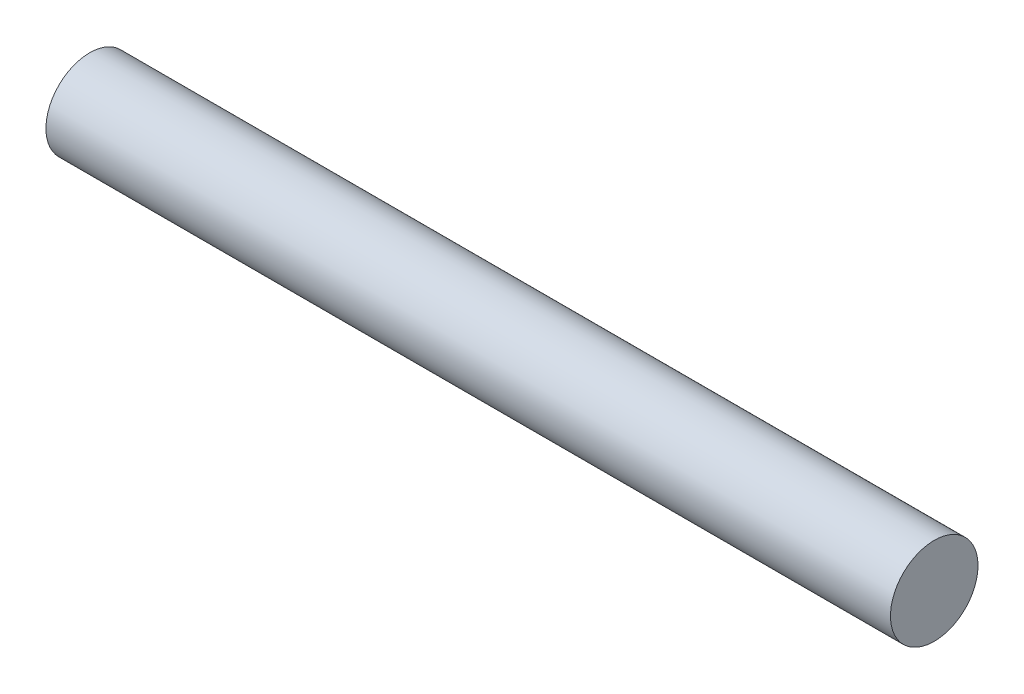
ISO-10303-21;
HEADER;
FILE_DESCRIPTION(('STEP AP214'),'2;1');
FILE_NAME('part.step','',(''),(''),'','','');
FILE_SCHEMA(('AUTOMOTIVE_DESIGN { 1 0 10303 214 1 1 1 1 }'));
ENDSEC;
DATA;
#1=APPLICATION_CONTEXT('core data for automotive mechanical design processes');
#2=APPLICATION_PROTOCOL_DEFINITION('international standard','automotive_design',2000,#1);
#3=PRODUCT_CONTEXT('',#1,'mechanical');
#4=PRODUCT('Part','Part','',(#3));
#5=PRODUCT_RELATED_PRODUCT_CATEGORY('part','',(#4));
#6=PRODUCT_DEFINITION_FORMATION('','',#4);
#7=PRODUCT_DEFINITION_CONTEXT('part definition',#1,'design');
#8=PRODUCT_DEFINITION('design','',#6,#7);
#9=PRODUCT_DEFINITION_SHAPE('','',#8);
#10=(LENGTH_UNIT() NAMED_UNIT(*) SI_UNIT(.MILLI.,.METRE.));
#11=(NAMED_UNIT(*) PLANE_ANGLE_UNIT() SI_UNIT($,.RADIAN.));
#12=(NAMED_UNIT(*) SI_UNIT($,.STERADIAN.) SOLID_ANGLE_UNIT());
#13=UNCERTAINTY_MEASURE_WITH_UNIT(LENGTH_MEASURE(1.E-05),#10,'distance_accuracy_value','');
#14=(GEOMETRIC_REPRESENTATION_CONTEXT(3) GLOBAL_UNCERTAINTY_ASSIGNED_CONTEXT((#13)) GLOBAL_UNIT_ASSIGNED_CONTEXT((#10,
#11,#12)) REPRESENTATION_CONTEXT('',''));
#15=CARTESIAN_POINT('',(0.,0.,0.));
#16=DIRECTION('',(0.,0.,1.));
#17=DIRECTION('',(1.,0.,0.));
#18=AXIS2_PLACEMENT_3D('',#15,#16,#17);
#19=CARTESIAN_POINT('',(110.,0.,0.));
#20=DIRECTION('',(-1.,0.,0.));
#21=DIRECTION('',(0.,0.,1.));
#22=AXIS2_PLACEMENT_3D('',#19,#20,#21);
#23=CYLINDRICAL_SURFACE('',#22,5.7);
#24=CARTESIAN_POINT('',(110.,0.,0.));
#25=DIRECTION('',(1.,0.,0.));
#26=DIRECTION('',(0.,0.,-1.));
#27=AXIS2_PLACEMENT_3D('',#24,#25,#26);
#28=CIRCLE('',#27,5.7);
#29=CARTESIAN_POINT('',(110.,0.,-5.7));
#30=VERTEX_POINT('',#29);
#31=EDGE_CURVE('E10',#30,#30,#28,.T.);
#32=ORIENTED_EDGE('',*,*,#31,.F.);
#33=EDGE_LOOP('',(#32));
#34=FACE_BOUND('',#33,.T.);
#35=CARTESIAN_POINT('',(0.,0.,0.));
#36=DIRECTION('',(1.,0.,0.));
#37=DIRECTION('',(0.,0.,-1.));
#38=AXIS2_PLACEMENT_3D('',#35,#36,#37);
#39=CIRCLE('',#38,5.7);
#40=CARTESIAN_POINT('',(0.,0.,-5.7));
#41=VERTEX_POINT('',#40);
#42=EDGE_CURVE('E35',#41,#41,#39,.T.);
#43=ORIENTED_EDGE('',*,*,#42,.T.);
#44=EDGE_LOOP('',(#43));
#45=FACE_BOUND('',#44,.T.);
#46=ADVANCED_FACE('F32',(#34,#45),#23,.T.);
#47=CARTESIAN_POINT('',(110.,0.,0.));
#48=DIRECTION('',(1.,0.,0.));
#49=DIRECTION('',(0.,0.,-1.));
#50=AXIS2_PLACEMENT_3D('',#47,#48,#49);
#51=PLANE('',#50);
#52=ORIENTED_EDGE('',*,*,#31,.T.);
#53=EDGE_LOOP('',(#52));
#54=FACE_BOUND('',#53,.T.);
#55=ADVANCED_FACE('F47',(#54),#51,.T.);
#56=CARTESIAN_POINT('',(0.,0.,0.));
#57=DIRECTION('',(1.,0.,0.));
#58=DIRECTION('',(0.,0.,-1.));
#59=AXIS2_PLACEMENT_3D('',#56,#57,#58);
#60=PLANE('',#59);
#61=ORIENTED_EDGE('',*,*,#42,.F.);
#62=EDGE_LOOP('',(#61));
#63=FACE_BOUND('',#62,.T.);
#64=ADVANCED_FACE('F45',(#63),#60,.F.);
#65=CLOSED_SHELL('',(#46,#55,#64));
#66=MANIFOLD_SOLID_BREP('B2',#65);
#67=ADVANCED_BREP_SHAPE_REPRESENTATION('',(#18,#66),#14);
#68=SHAPE_DEFINITION_REPRESENTATION(#9,#67);
ENDSEC;
END-ISO-10303-21;
